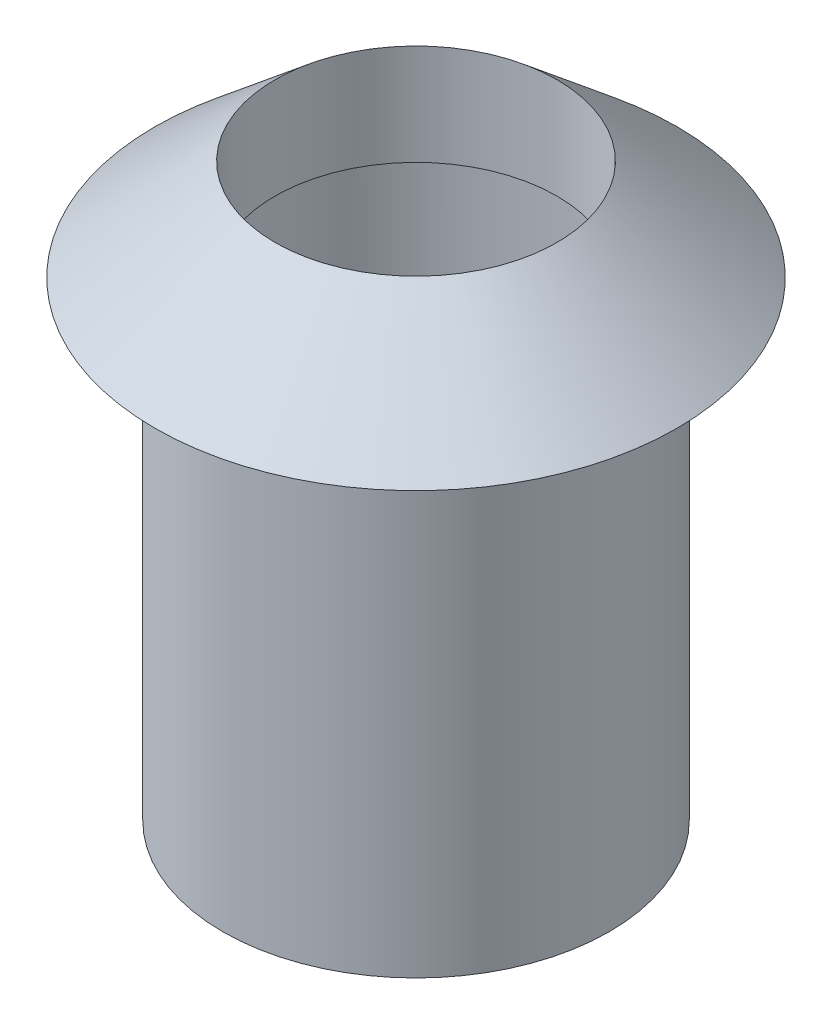
ISO-10303-21;
HEADER;
FILE_DESCRIPTION(('STEP AP214'),'2;1');
FILE_NAME('part.step','',(''),(''),'','','');
FILE_SCHEMA(('AUTOMOTIVE_DESIGN { 1 0 10303 214 1 1 1 1 }'));
ENDSEC;
DATA;
#1=APPLICATION_CONTEXT('core data for automotive mechanical design processes');
#2=APPLICATION_PROTOCOL_DEFINITION('international standard','automotive_design',2000,#1);
#3=PRODUCT_CONTEXT('',#1,'mechanical');
#4=PRODUCT('Part','Part','',(#3));
#5=PRODUCT_RELATED_PRODUCT_CATEGORY('part','',(#4));
#6=PRODUCT_DEFINITION_FORMATION('','',#4);
#7=PRODUCT_DEFINITION_CONTEXT('part definition',#1,'design');
#8=PRODUCT_DEFINITION('design','',#6,#7);
#9=PRODUCT_DEFINITION_SHAPE('','',#8);
#10=(LENGTH_UNIT() NAMED_UNIT(*) SI_UNIT(.MILLI.,.METRE.));
#11=(NAMED_UNIT(*) PLANE_ANGLE_UNIT() SI_UNIT($,.RADIAN.));
#12=(NAMED_UNIT(*) SI_UNIT($,.STERADIAN.) SOLID_ANGLE_UNIT());
#13=UNCERTAINTY_MEASURE_WITH_UNIT(LENGTH_MEASURE(1.E-05),#10,'distance_accuracy_value','');
#14=(GEOMETRIC_REPRESENTATION_CONTEXT(3) GLOBAL_UNCERTAINTY_ASSIGNED_CONTEXT((#13)) GLOBAL_UNIT_ASSIGNED_CONTEXT((#10,
#11,#12)) REPRESENTATION_CONTEXT('',''));
#15=CARTESIAN_POINT('',(0.,0.,0.));
#16=DIRECTION('',(0.,0.,1.));
#17=DIRECTION('',(1.,0.,0.));
#18=AXIS2_PLACEMENT_3D('',#15,#16,#17);
#19=CARTESIAN_POINT('',(-8.67316315733676,0.,0.));
#20=DIRECTION('',(0.,1.,0.));
#21=DIRECTION('',(0.,0.,1.));
#22=AXIS2_PLACEMENT_3D('',#19,#20,#21);
#23=PLANE('',#22);
#24=CARTESIAN_POINT('',(-8.67316315733676,0.,0.));
#25=DIRECTION('',(0.,1.,0.));
#26=DIRECTION('',(0.,0.,1.));
#27=AXIS2_PLACEMENT_3D('',#24,#25,#26);
#28=CIRCLE('',#27,3.7);
#29=CARTESIAN_POINT('',(-8.67316315733676,0.,3.7));
#30=VERTEX_POINT('',#29);
#31=EDGE_CURVE('E10',#30,#30,#28,.F.);
#32=ORIENTED_EDGE('',*,*,#31,.F.);
#33=EDGE_LOOP('',(#32));
#34=FACE_BOUND('',#33,.T.);
#35=CARTESIAN_POINT('',(-8.67316315733676,0.,0.));
#36=DIRECTION('',(0.,1.,0.));
#37=DIRECTION('',(0.,0.,1.));
#38=AXIS2_PLACEMENT_3D('',#35,#36,#37);
#39=CIRCLE('',#38,5.);
#40=CARTESIAN_POINT('',(-8.67316315733676,0.,5.));
#41=VERTEX_POINT('',#40);
#42=EDGE_CURVE('E47',#41,#41,#39,.T.);
#43=ORIENTED_EDGE('',*,*,#42,.F.);
#44=EDGE_LOOP('',(#43));
#45=FACE_BOUND('',#44,.T.);
#46=ADVANCED_FACE('F35',(#34,#45),#23,.F.);
#47=CARTESIAN_POINT('',(-8.67316315733676,2.,0.));
#48=DIRECTION('',(0.,-1.,0.));
#49=DIRECTION('',(0.,0.,-1.));
#50=AXIS2_PLACEMENT_3D('',#47,#48,#49);
#51=CYLINDRICAL_SURFACE('',#50,2.7);
#52=CARTESIAN_POINT('',(-8.67316315733676,1.92992915170771,0.));
#53=DIRECTION('',(0.,-1.,0.));
#54=DIRECTION('',(0.,0.,-1.));
#55=AXIS2_PLACEMENT_3D('',#52,#53,#54);
#56=CIRCLE('',#55,2.7);
#57=CARTESIAN_POINT('',(-8.67316315733676,1.92992915170771,-2.7));
#58=VERTEX_POINT('',#57);
#59=EDGE_CURVE('E43',#58,#58,#56,.F.);
#60=ORIENTED_EDGE('',*,*,#59,.T.);
#61=EDGE_LOOP('',(#60));
#62=FACE_BOUND('',#61,.T.);
#63=CARTESIAN_POINT('',(-8.67316315733676,0.,0.));
#64=DIRECTION('',(0.,1.,0.));
#65=DIRECTION('',(0.,0.,1.));
#66=AXIS2_PLACEMENT_3D('',#63,#64,#65);
#67=CIRCLE('',#66,2.7);
#68=CARTESIAN_POINT('',(-8.67316315733676,0.,2.7));
#69=VERTEX_POINT('',#68);
#70=EDGE_CURVE('E54',#69,#69,#67,.T.);
#71=ORIENTED_EDGE('',*,*,#70,.F.);
#72=EDGE_LOOP('',(#71));
#73=FACE_BOUND('',#72,.T.);
#74=ADVANCED_FACE('F91',(#62,#73),#51,.F.);
#75=CARTESIAN_POINT('',(-8.67316315733676,2.,0.));
#76=DIRECTION('',(0.,-1.,0.));
#77=DIRECTION('',(0.,0.,-1.));
#78=AXIS2_PLACEMENT_3D('',#75,#76,#77);
#79=CONICAL_SURFACE('',#78,2.61649281481154,0.872664625997169);
#80=ORIENTED_EDGE('',*,*,#42,.T.);
#81=EDGE_LOOP('',(#80));
#82=FACE_BOUND('',#81,.T.);
#83=ORIENTED_EDGE('',*,*,#59,.F.);
#84=EDGE_LOOP('',(#83));
#85=FACE_BOUND('',#84,.T.);
#86=ADVANCED_FACE('F38',(#82,#85),#79,.T.);
#87=CARTESIAN_POINT('',(-8.67316315733676,-9.,0.));
#88=DIRECTION('',(0.,1.,0.));
#89=DIRECTION('',(0.,0.,1.));
#90=AXIS2_PLACEMENT_3D('',#87,#88,#89);
#91=CYLINDRICAL_SURFACE('',#90,3.7);
#92=CARTESIAN_POINT('',(-8.67316315733676,-9.,0.));
#93=DIRECTION('',(0.,-1.,0.));
#94=DIRECTION('',(0.,0.,-1.));
#95=AXIS2_PLACEMENT_3D('',#92,#93,#94);
#96=CIRCLE('',#95,3.7);
#97=CARTESIAN_POINT('',(-8.67316315733676,-9.,-3.7));
#98=VERTEX_POINT('',#97);
#99=EDGE_CURVE('E51',#98,#98,#96,.T.);
#100=ORIENTED_EDGE('',*,*,#99,.F.);
#101=EDGE_LOOP('',(#100));
#102=FACE_BOUND('',#101,.T.);
#103=ORIENTED_EDGE('',*,*,#31,.T.);
#104=EDGE_LOOP('',(#103));
#105=FACE_BOUND('',#104,.T.);
#106=ADVANCED_FACE('F99',(#102,#105),#91,.T.);
#107=CARTESIAN_POINT('',(-8.67316315733676,-9.,0.));
#108=DIRECTION('',(0.,-1.,0.));
#109=DIRECTION('',(0.,0.,-1.));
#110=AXIS2_PLACEMENT_3D('',#107,#108,#109);
#111=PLANE('',#110);
#112=CARTESIAN_POINT('',(-8.67316315733676,-9.,0.));
#113=DIRECTION('',(0.,-1.,0.));
#114=DIRECTION('',(0.,0.,-1.));
#115=AXIS2_PLACEMENT_3D('',#112,#113,#114);
#116=CIRCLE('',#115,3.2);
#117=CARTESIAN_POINT('',(-8.67316315733676,-9.,-3.2));
#118=VERTEX_POINT('',#117);
#119=EDGE_CURVE('E60',#118,#118,#116,.T.);
#120=ORIENTED_EDGE('',*,*,#119,.F.);
#121=EDGE_LOOP('',(#120));
#122=FACE_BOUND('',#121,.T.);
#123=ORIENTED_EDGE('',*,*,#99,.T.);
#124=EDGE_LOOP('',(#123));
#125=FACE_BOUND('',#124,.T.);
#126=ADVANCED_FACE('F101',(#122,#125),#111,.T.);
#127=CARTESIAN_POINT('',(-8.67316315733676,0.,0.));
#128=DIRECTION('',(0.,-1.,0.));
#129=DIRECTION('',(0.,0.,-1.));
#130=AXIS2_PLACEMENT_3D('',#127,#128,#129);
#131=PLANE('',#130);
#132=CARTESIAN_POINT('',(-8.67316315733676,0.,0.));
#133=DIRECTION('',(0.,-1.,0.));
#134=DIRECTION('',(0.,0.,-1.));
#135=AXIS2_PLACEMENT_3D('',#132,#133,#134);
#136=CIRCLE('',#135,3.2);
#137=CARTESIAN_POINT('',(-8.67316315733676,0.,-3.2));
#138=VERTEX_POINT('',#137);
#139=EDGE_CURVE('E63',#138,#138,#136,.F.);
#140=ORIENTED_EDGE('',*,*,#139,.F.);
#141=EDGE_LOOP('',(#140));
#142=FACE_BOUND('',#141,.T.);
#143=ORIENTED_EDGE('',*,*,#70,.T.);
#144=EDGE_LOOP('',(#143));
#145=FACE_BOUND('',#144,.T.);
#146=ADVANCED_FACE('F104',(#142,#145),#131,.T.);
#147=CARTESIAN_POINT('',(-8.67316315733676,0.5,0.));
#148=DIRECTION('',(0.,1.,0.));
#149=DIRECTION('',(0.,0.,1.));
#150=AXIS2_PLACEMENT_3D('',#147,#148,#149);
#151=PLANE('',#150);
#152=CARTESIAN_POINT('',(-8.67316315733676,0.5,0.));
#153=DIRECTION('',(0.,1.,0.));
#154=DIRECTION('',(0.,0.,1.));
#155=AXIS2_PLACEMENT_3D('',#152,#153,#154);
#156=CIRCLE('',#155,3.2);
#157=CARTESIAN_POINT('',(-8.67316315733676,0.5,3.2));
#158=VERTEX_POINT('',#157);
#159=EDGE_CURVE('E57',#158,#158,#156,.F.);
#160=ORIENTED_EDGE('',*,*,#159,.T.);
#161=EDGE_LOOP('',(#160));
#162=FACE_BOUND('',#161,.T.);
#163=CARTESIAN_POINT('',(-8.67316315733676,0.5,0.));
#164=DIRECTION('',(0.,1.,0.));
#165=DIRECTION('',(0.,0.,1.));
#166=AXIS2_PLACEMENT_3D('',#163,#164,#165);
#167=CIRCLE('',#166,3.62626129027266);
#168=CARTESIAN_POINT('',(-8.67316315733676,0.5,3.62626129027266));
#169=VERTEX_POINT('',#168);
#170=EDGE_CURVE('E66',#169,#169,#167,.T.);
#171=ORIENTED_EDGE('',*,*,#170,.T.);
#172=EDGE_LOOP('',(#171));
#173=FACE_BOUND('',#172,.T.);
#174=ADVANCED_FACE('F75',(#162,#173),#151,.T.);
#175=CARTESIAN_POINT('',(-8.67316315733676,2.,0.));
#176=DIRECTION('',(0.,-1.,0.));
#177=DIRECTION('',(0.,0.,-1.));
#178=AXIS2_PLACEMENT_3D('',#175,#176,#177);
#179=CYLINDRICAL_SURFACE('',#178,3.2);
#180=CARTESIAN_POINT('',(-8.67316315733676,0.857675691452936,0.));
#181=DIRECTION('',(0.,-1.,0.));
#182=DIRECTION('',(0.,0.,-1.));
#183=AXIS2_PLACEMENT_3D('',#180,#181,#182);
#184=CIRCLE('',#183,3.2);
#185=CARTESIAN_POINT('',(-8.67316315733676,0.857675691452936,-3.2));
#186=VERTEX_POINT('',#185);
#187=EDGE_CURVE('E67',#186,#186,#184,.F.);
#188=ORIENTED_EDGE('',*,*,#187,.F.);
#189=EDGE_LOOP('',(#188));
#190=FACE_BOUND('',#189,.T.);
#191=ORIENTED_EDGE('',*,*,#139,.T.);
#192=EDGE_LOOP('',(#191));
#193=FACE_BOUND('',#192,.T.);
#194=ADVANCED_FACE('F86',(#190,#193),#179,.T.);
#195=CARTESIAN_POINT('',(-8.67316315733676,1.61697777844051,0.));
#196=DIRECTION('',(0.,-1.,0.));
#197=DIRECTION('',(0.,0.,-1.));
#198=AXIS2_PLACEMENT_3D('',#195,#196,#197);
#199=CONICAL_SURFACE('',#198,2.29509900996827,0.872664625997169);
#200=ORIENTED_EDGE('',*,*,#170,.F.);
#201=EDGE_LOOP('',(#200));
#202=FACE_BOUND('',#201,.T.);
#203=ORIENTED_EDGE('',*,*,#187,.T.);
#204=EDGE_LOOP('',(#203));
#205=FACE_BOUND('',#204,.T.);
#206=ADVANCED_FACE('F80',(#202,#205),#199,.F.);
#207=CARTESIAN_POINT('',(-8.67316315733676,-9.,0.));
#208=DIRECTION('',(0.,1.,0.));
#209=DIRECTION('',(0.,0.,1.));
#210=AXIS2_PLACEMENT_3D('',#207,#208,#209);
#211=CYLINDRICAL_SURFACE('',#210,3.2);
#212=ORIENTED_EDGE('',*,*,#119,.T.);
#213=EDGE_LOOP('',(#212));
#214=FACE_BOUND('',#213,.T.);
#215=ORIENTED_EDGE('',*,*,#159,.F.);
#216=EDGE_LOOP('',(#215));
#217=FACE_BOUND('',#216,.T.);
#218=ADVANCED_FACE('F78',(#214,#217),#211,.F.);
#219=CLOSED_SHELL('',(#46,#74,#86,#106,#126,#146,#174,#194,#206,#218));
#220=MANIFOLD_SOLID_BREP('B2',#219);
#221=ADVANCED_BREP_SHAPE_REPRESENTATION('',(#18,#220),#14);
#222=SHAPE_DEFINITION_REPRESENTATION(#9,#221);
ENDSEC;
END-ISO-10303-21;
